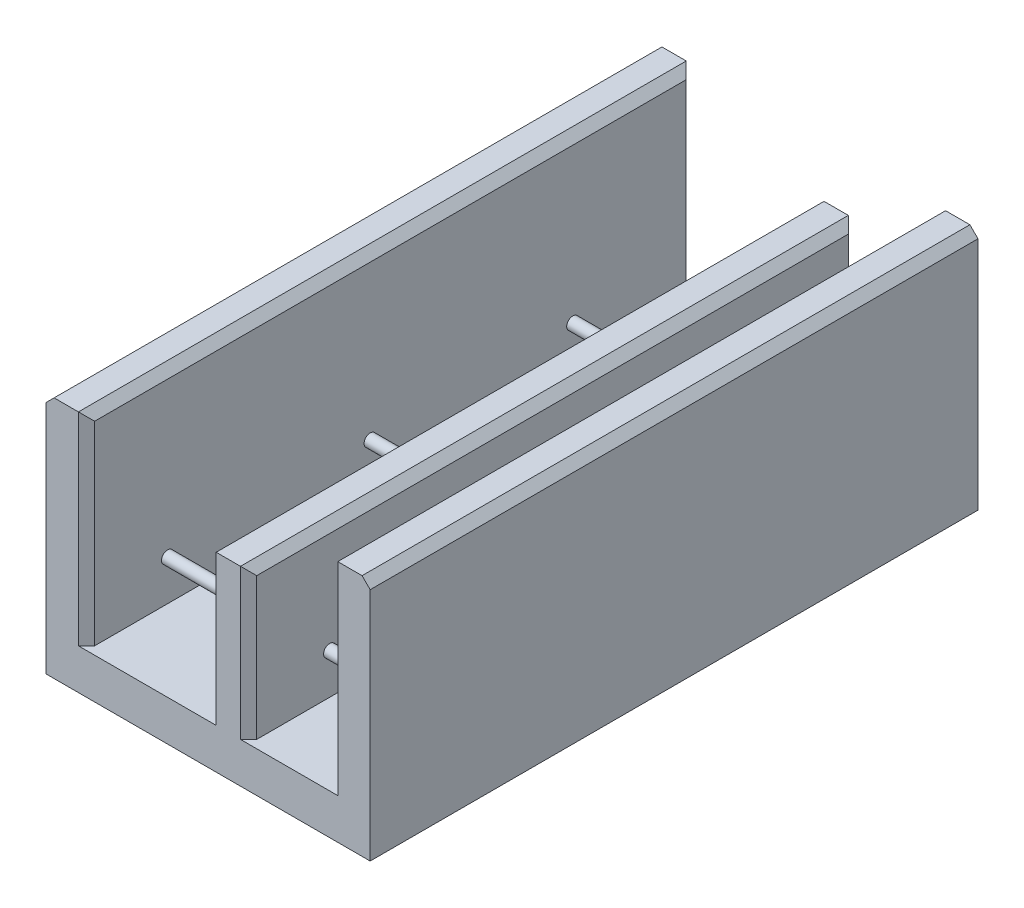
ISO-10303-21;
HEADER;
FILE_DESCRIPTION(('STEP AP214'),'2;1');
FILE_NAME('part.step','',(''),(''),'','','');
FILE_SCHEMA(('AUTOMOTIVE_DESIGN { 1 0 10303 214 1 1 1 1 }'));
ENDSEC;
DATA;
#1=APPLICATION_CONTEXT('core data for automotive mechanical design processes');
#2=APPLICATION_PROTOCOL_DEFINITION('international standard','automotive_design',2000,#1);
#3=PRODUCT_CONTEXT('',#1,'mechanical');
#4=PRODUCT('Part','Part','',(#3));
#5=PRODUCT_RELATED_PRODUCT_CATEGORY('part','',(#4));
#6=PRODUCT_DEFINITION_FORMATION('','',#4);
#7=PRODUCT_DEFINITION_CONTEXT('part definition',#1,'design');
#8=PRODUCT_DEFINITION('design','',#6,#7);
#9=PRODUCT_DEFINITION_SHAPE('','',#8);
#10=(LENGTH_UNIT() NAMED_UNIT(*) SI_UNIT(.MILLI.,.METRE.));
#11=(NAMED_UNIT(*) PLANE_ANGLE_UNIT() SI_UNIT($,.RADIAN.));
#12=(NAMED_UNIT(*) SI_UNIT($,.STERADIAN.) SOLID_ANGLE_UNIT());
#13=UNCERTAINTY_MEASURE_WITH_UNIT(LENGTH_MEASURE(1.E-05),#10,'distance_accuracy_value','');
#14=(GEOMETRIC_REPRESENTATION_CONTEXT(3) GLOBAL_UNCERTAINTY_ASSIGNED_CONTEXT((#13)) GLOBAL_UNIT_ASSIGNED_CONTEXT((#10,
#11,#12)) REPRESENTATION_CONTEXT('',''));
#15=CARTESIAN_POINT('',(0.,0.,0.));
#16=DIRECTION('',(0.,0.,1.));
#17=DIRECTION('',(1.,0.,0.));
#18=AXIS2_PLACEMENT_3D('',#15,#16,#17);
#19=CARTESIAN_POINT('',(0.,600.,1500.));
#20=DIRECTION('',(-1.,0.,0.));
#21=DIRECTION('',(0.,0.,1.));
#22=AXIS2_PLACEMENT_3D('',#19,#20,#21);
#23=PLANE('',#22);
#24=DIRECTION('',(0.,1.,0.));
#25=VECTOR('',#24,1.);
#26=CARTESIAN_POINT('',(0.,600.,0.));
#27=LINE('',#26,#25);
#28=CARTESIAN_POINT('',(0.,0.,0.));
#29=VERTEX_POINT('',#28);
#30=CARTESIAN_POINT('',(0.,580.,0.));
#31=VERTEX_POINT('',#30);
#32=EDGE_CURVE('E219',#29,#31,#27,.T.);
#33=ORIENTED_EDGE('',*,*,#32,.T.);
#34=DIRECTION('',(0.,0.,1.));
#35=VECTOR('',#34,1.);
#36=CARTESIAN_POINT('',(0.,580.,1500.));
#37=LINE('',#36,#35);
#38=CARTESIAN_POINT('',(0.,580.,1500.));
#39=VERTEX_POINT('',#38);
#40=EDGE_CURVE('E289',#31,#39,#37,.T.);
#41=ORIENTED_EDGE('',*,*,#40,.T.);
#42=DIRECTION('',(0.,1.,0.));
#43=VECTOR('',#42,1.);
#44=CARTESIAN_POINT('',(0.,600.,1500.));
#45=LINE('',#44,#43);
#46=CARTESIAN_POINT('',(0.,0.,1500.));
#47=VERTEX_POINT('',#46);
#48=EDGE_CURVE('E238',#47,#39,#45,.T.);
#49=ORIENTED_EDGE('',*,*,#48,.F.);
#50=DIRECTION('',(0.,0.,-1.));
#51=VECTOR('',#50,1.);
#52=CARTESIAN_POINT('',(0.,0.,1500.));
#53=LINE('',#52,#51);
#54=EDGE_CURVE('E210',#47,#29,#53,.T.);
#55=ORIENTED_EDGE('',*,*,#54,.T.);
#56=EDGE_LOOP('',(#33,#41,#49,#55));
#57=FACE_BOUND('',#56,.T.);
#58=ADVANCED_FACE('F37',(#57),#23,.F.);
#59=CARTESIAN_POINT('',(-100.,600.,1500.));
#60=DIRECTION('',(0.,-1.,0.));
#61=DIRECTION('',(0.,0.,-1.));
#62=AXIS2_PLACEMENT_3D('',#59,#60,#61);
#63=PLANE('',#62);
#64=DIRECTION('',(-1.,0.,0.));
#65=VECTOR('',#64,1.);
#66=CARTESIAN_POINT('',(-100.,600.,1500.));
#67=LINE('',#66,#65);
#68=CARTESIAN_POINT('',(-19.9999999999998,600.,1500.));
#69=VERTEX_POINT('',#68);
#70=CARTESIAN_POINT('',(-80.0000000000002,600.,1500.));
#71=VERTEX_POINT('',#70);
#72=EDGE_CURVE('E369',#69,#71,#67,.T.);
#73=ORIENTED_EDGE('',*,*,#72,.F.);
#74=DIRECTION('',(0.,0.,-1.));
#75=VECTOR('',#74,1.);
#76=CARTESIAN_POINT('',(-19.9999999999998,600.,1500.));
#77=LINE('',#76,#75);
#78=CARTESIAN_POINT('',(-19.9999999999998,600.,0.));
#79=VERTEX_POINT('',#78);
#80=EDGE_CURVE('E286',#69,#79,#77,.T.);
#81=ORIENTED_EDGE('',*,*,#80,.T.);
#82=DIRECTION('',(-1.,0.,0.));
#83=VECTOR('',#82,1.);
#84=CARTESIAN_POINT('',(-100.,600.,0.));
#85=LINE('',#84,#83);
#86=CARTESIAN_POINT('',(-80.0000000000002,600.,0.));
#87=VERTEX_POINT('',#86);
#88=EDGE_CURVE('E222',#79,#87,#85,.T.);
#89=ORIENTED_EDGE('',*,*,#88,.T.);
#90=DIRECTION('',(0.,0.,1.));
#91=VECTOR('',#90,1.);
#92=CARTESIAN_POINT('',(-80.0000000000002,600.,1500.));
#93=LINE('',#92,#91);
#94=EDGE_CURVE('E284',#87,#71,#93,.T.);
#95=ORIENTED_EDGE('',*,*,#94,.T.);
#96=EDGE_LOOP('',(#73,#81,#89,#95));
#97=FACE_BOUND('',#96,.T.);
#98=ADVANCED_FACE('F398',(#97),#63,.F.);
#99=CARTESIAN_POINT('',(-100.,99.9999999999998,1500.));
#100=DIRECTION('',(1.,0.,0.));
#101=DIRECTION('',(0.,0.,-1.));
#102=AXIS2_PLACEMENT_3D('',#99,#100,#101);
#103=PLANE('',#102);
#104=CARTESIAN_POINT('',(-100.,200.,1300.));
#105=DIRECTION('',(1.,0.,0.));
#106=DIRECTION('',(0.,0.,-1.));
#107=AXIS2_PLACEMENT_3D('',#104,#105,#106);
#108=CIRCLE('',#107,15.);
#109=CARTESIAN_POINT('',(-100.,200.,1285.));
#110=VERTEX_POINT('',#109);
#111=EDGE_CURVE('E813',#110,#110,#108,.F.);
#112=ORIENTED_EDGE('',*,*,#111,.F.);
#113=EDGE_LOOP('',(#112));
#114=FACE_BOUND('',#113,.T.);
#115=CARTESIAN_POINT('',(-100.,200.,800.));
#116=DIRECTION('',(1.,0.,0.));
#117=DIRECTION('',(0.,0.,-1.));
#118=AXIS2_PLACEMENT_3D('',#115,#116,#117);
#119=CIRCLE('',#118,15.);
#120=CARTESIAN_POINT('',(-100.,200.,785.));
#121=VERTEX_POINT('',#120);
#122=EDGE_CURVE('E803',#121,#121,#119,.F.);
#123=ORIENTED_EDGE('',*,*,#122,.F.);
#124=EDGE_LOOP('',(#123));
#125=FACE_BOUND('',#124,.T.);
#126=CARTESIAN_POINT('',(-100.,200.,300.));
#127=DIRECTION('',(1.,0.,0.));
#128=DIRECTION('',(0.,0.,-1.));
#129=AXIS2_PLACEMENT_3D('',#126,#127,#128);
#130=CIRCLE('',#129,15.);
#131=CARTESIAN_POINT('',(-100.,200.,285.));
#132=VERTEX_POINT('',#131);
#133=EDGE_CURVE('E544',#132,#132,#130,.F.);
#134=ORIENTED_EDGE('',*,*,#133,.F.);
#135=EDGE_LOOP('',(#134));
#136=FACE_BOUND('',#135,.T.);
#137=DIRECTION('',(0.,0.,-1.));
#138=VECTOR('',#137,1.);
#139=CARTESIAN_POINT('',(-100.,580.,1500.));
#140=LINE('',#139,#138);
#141=CARTESIAN_POINT('',(-100.,580.,1480.));
#142=VERTEX_POINT('',#141);
#143=CARTESIAN_POINT('',(-100.,580.,20.));
#144=VERTEX_POINT('',#143);
#145=EDGE_CURVE('E300',#142,#144,#140,.T.);
#146=ORIENTED_EDGE('',*,*,#145,.T.);
#147=DIRECTION('',(0.,-1.,0.));
#148=VECTOR('',#147,1.);
#149=CARTESIAN_POINT('',(-100.,99.9999999999998,20.));
#150=LINE('',#149,#148);
#151=CARTESIAN_POINT('',(-100.,99.9999999999998,20.));
#152=VERTEX_POINT('',#151);
#153=EDGE_CURVE('E302',#144,#152,#150,.T.);
#154=ORIENTED_EDGE('',*,*,#153,.T.);
#155=DIRECTION('',(0.,0.,-1.));
#156=VECTOR('',#155,1.);
#157=CARTESIAN_POINT('',(-100.,99.9999999999998,1500.));
#158=LINE('',#157,#156);
#159=CARTESIAN_POINT('',(-100.,99.9999999999998,1480.));
#160=VERTEX_POINT('',#159);
#161=EDGE_CURVE('E248',#160,#152,#158,.T.);
#162=ORIENTED_EDGE('',*,*,#161,.F.);
#163=DIRECTION('',(0.,1.,0.));
#164=VECTOR('',#163,1.);
#165=CARTESIAN_POINT('',(-100.,99.9999999999998,1480.));
#166=LINE('',#165,#164);
#167=EDGE_CURVE('E298',#160,#142,#166,.T.);
#168=ORIENTED_EDGE('',*,*,#167,.T.);
#169=EDGE_LOOP('',(#146,#154,#162,#168));
#170=FACE_BOUND('',#169,.T.);
#171=ADVANCED_FACE('F418',(#114,#125,#136,#170),#103,.F.);
#172=CARTESIAN_POINT('',(-300.,99.9999999999998,1500.));
#173=DIRECTION('',(0.,-1.,0.));
#174=DIRECTION('',(0.,0.,-1.));
#175=AXIS2_PLACEMENT_3D('',#172,#173,#174);
#176=PLANE('',#175);
#177=DIRECTION('',(-1.,0.,0.));
#178=VECTOR('',#177,1.);
#179=CARTESIAN_POINT('',(-300.,99.9999999999998,0.));
#180=LINE('',#179,#178);
#181=CARTESIAN_POINT('',(-80.0000000000002,99.9999999999998,0.));
#182=VERTEX_POINT('',#181);
#183=CARTESIAN_POINT('',(-320.000000000001,99.9999999999998,0.));
#184=VERTEX_POINT('',#183);
#185=EDGE_CURVE('E226',#182,#184,#180,.T.);
#186=ORIENTED_EDGE('',*,*,#185,.T.);
#187=DIRECTION('',(0.707106781186548,0.,0.707106781186547));
#188=VECTOR('',#187,1.);
#189=CARTESIAN_POINT('',(440.,99.9999999999998,760.));
#190=LINE('',#189,#188);
#191=CARTESIAN_POINT('',(-300.,99.9999999999998,20.0000000000005));
#192=VERTEX_POINT('',#191);
#193=EDGE_CURVE('E330',#184,#192,#190,.T.);
#194=ORIENTED_EDGE('',*,*,#193,.T.);
#195=DIRECTION('',(0.,0.,-1.));
#196=VECTOR('',#195,1.);
#197=CARTESIAN_POINT('',(-300.,99.9999999999998,1500.));
#198=LINE('',#197,#196);
#199=CARTESIAN_POINT('',(-300.,99.9999999999998,1480.));
#200=VERTEX_POINT('',#199);
#201=EDGE_CURVE('E245',#200,#192,#198,.T.);
#202=ORIENTED_EDGE('',*,*,#201,.F.);
#203=DIRECTION('',(0.707106781186548,0.,-0.707106781186547));
#204=VECTOR('',#203,1.);
#205=CARTESIAN_POINT('',(-310.,99.9999999999998,1490.));
#206=LINE('',#205,#204);
#207=CARTESIAN_POINT('',(-320.000000000001,99.9999999999998,1500.));
#208=VERTEX_POINT('',#207);
#209=EDGE_CURVE('E332',#200,#208,#206,.F.);
#210=ORIENTED_EDGE('',*,*,#209,.T.);
#211=DIRECTION('',(-1.,0.,0.));
#212=VECTOR('',#211,1.);
#213=CARTESIAN_POINT('',(-300.,99.9999999999998,1500.));
#214=LINE('',#213,#212);
#215=CARTESIAN_POINT('',(-80.0000000000002,99.9999999999998,1500.));
#216=VERTEX_POINT('',#215);
#217=EDGE_CURVE('E372',#216,#208,#214,.T.);
#218=ORIENTED_EDGE('',*,*,#217,.F.);
#219=DIRECTION('',(0.707106781186548,0.,0.707106781186548));
#220=VECTOR('',#219,1.);
#221=CARTESIAN_POINT('',(-190.,99.9999999999998,1390.));
#222=LINE('',#221,#220);
#223=EDGE_CURVE('E328',#216,#160,#222,.F.);
#224=ORIENTED_EDGE('',*,*,#223,.T.);
#225=ORIENTED_EDGE('',*,*,#161,.T.);
#226=DIRECTION('',(0.707106781186548,0.,-0.707106781186548));
#227=VECTOR('',#226,1.);
#228=CARTESIAN_POINT('',(-940.,99.9999999999998,860.));
#229=LINE('',#228,#227);
#230=EDGE_CURVE('E325',#152,#182,#229,.T.);
#231=ORIENTED_EDGE('',*,*,#230,.T.);
#232=EDGE_LOOP('',(#186,#194,#202,#210,#218,#224,#225,#231));
#233=FACE_BOUND('',#232,.T.);
#234=ADVANCED_FACE('F416',(#233),#176,.F.);
#235=CARTESIAN_POINT('',(-300.,470.,1500.));
#236=DIRECTION('',(-1.,0.,0.));
#237=DIRECTION('',(0.,-1.,0.));
#238=AXIS2_PLACEMENT_3D('',#235,#236,#237);
#239=PLANE('',#238);
#240=CARTESIAN_POINT('',(-300.,200.,1300.));
#241=DIRECTION('',(-1.,0.,0.));
#242=DIRECTION('',(0.,-1.,0.));
#243=AXIS2_PLACEMENT_3D('',#240,#241,#242);
#244=CIRCLE('',#243,15.);
#245=CARTESIAN_POINT('',(-300.,185.,1300.));
#246=VERTEX_POINT('',#245);
#247=EDGE_CURVE('E537',#246,#246,#244,.T.);
#248=ORIENTED_EDGE('',*,*,#247,.T.);
#249=EDGE_LOOP('',(#248));
#250=FACE_BOUND('',#249,.T.);
#251=CARTESIAN_POINT('',(-300.,200.,800.));
#252=DIRECTION('',(-1.,0.,0.));
#253=DIRECTION('',(0.,-1.,0.));
#254=AXIS2_PLACEMENT_3D('',#251,#252,#253);
#255=CIRCLE('',#254,15.);
#256=CARTESIAN_POINT('',(-300.,185.,800.));
#257=VERTEX_POINT('',#256);
#258=EDGE_CURVE('E540',#257,#257,#255,.T.);
#259=ORIENTED_EDGE('',*,*,#258,.T.);
#260=EDGE_LOOP('',(#259));
#261=FACE_BOUND('',#260,.T.);
#262=CARTESIAN_POINT('',(-300.,200.,300.));
#263=DIRECTION('',(-1.,0.,0.));
#264=DIRECTION('',(0.,-1.,0.));
#265=AXIS2_PLACEMENT_3D('',#262,#263,#264);
#266=CIRCLE('',#265,15.);
#267=CARTESIAN_POINT('',(-300.,185.,300.));
#268=VERTEX_POINT('',#267);
#269=EDGE_CURVE('E353',#268,#268,#266,.T.);
#270=ORIENTED_EDGE('',*,*,#269,.T.);
#271=EDGE_LOOP('',(#270));
#272=FACE_BOUND('',#271,.T.);
#273=ORIENTED_EDGE('',*,*,#201,.T.);
#274=DIRECTION('',(0.,1.,0.));
#275=VECTOR('',#274,1.);
#276=CARTESIAN_POINT('',(-300.,470.,20.0000000000005));
#277=LINE('',#276,#275);
#278=CARTESIAN_POINT('',(-300.,449.999999999999,20.0000000000005));
#279=VERTEX_POINT('',#278);
#280=EDGE_CURVE('E309',#192,#279,#277,.T.);
#281=ORIENTED_EDGE('',*,*,#280,.T.);
#282=DIRECTION('',(0.,0.,1.));
#283=VECTOR('',#282,1.);
#284=CARTESIAN_POINT('',(-300.,449.999999999999,1500.));
#285=LINE('',#284,#283);
#286=CARTESIAN_POINT('',(-300.,449.999999999999,1480.));
#287=VERTEX_POINT('',#286);
#288=EDGE_CURVE('E305',#279,#287,#285,.T.);
#289=ORIENTED_EDGE('',*,*,#288,.T.);
#290=DIRECTION('',(0.,-1.,0.));
#291=VECTOR('',#290,1.);
#292=CARTESIAN_POINT('',(-300.,470.,1480.));
#293=LINE('',#292,#291);
#294=EDGE_CURVE('E307',#287,#200,#293,.T.);
#295=ORIENTED_EDGE('',*,*,#294,.T.);
#296=EDGE_LOOP('',(#273,#281,#289,#295));
#297=FACE_BOUND('',#296,.T.);
#298=ADVANCED_FACE('F426',(#250,#261,#272,#297),#239,.F.);
#299=CARTESIAN_POINT('',(-400.,470.,1500.));
#300=DIRECTION('',(0.,-1.,0.));
#301=DIRECTION('',(1.,0.,0.));
#302=AXIS2_PLACEMENT_3D('',#299,#300,#301);
#303=PLANE('',#302);
#304=DIRECTION('',(-1.,0.,0.));
#305=VECTOR('',#304,1.);
#306=CARTESIAN_POINT('',(-400.,470.,1500.));
#307=LINE('',#306,#305);
#308=CARTESIAN_POINT('',(-320.000000000001,470.,1500.));
#309=VERTEX_POINT('',#308);
#310=CARTESIAN_POINT('',(-380.,470.,1500.));
#311=VERTEX_POINT('',#310);
#312=EDGE_CURVE('E374',#309,#311,#307,.T.);
#313=ORIENTED_EDGE('',*,*,#312,.F.);
#314=DIRECTION('',(0.,0.,-1.));
#315=VECTOR('',#314,1.);
#316=CARTESIAN_POINT('',(-320.000000000001,470.,1500.));
#317=LINE('',#316,#315);
#318=CARTESIAN_POINT('',(-320.000000000001,470.,0.));
#319=VERTEX_POINT('',#318);
#320=EDGE_CURVE('E314',#309,#319,#317,.T.);
#321=ORIENTED_EDGE('',*,*,#320,.T.);
#322=DIRECTION('',(-1.,0.,0.));
#323=VECTOR('',#322,1.);
#324=CARTESIAN_POINT('',(-400.,470.,0.));
#325=LINE('',#324,#323);
#326=CARTESIAN_POINT('',(-380.,470.,0.));
#327=VERTEX_POINT('',#326);
#328=EDGE_CURVE('E228',#319,#327,#325,.T.);
#329=ORIENTED_EDGE('',*,*,#328,.T.);
#330=DIRECTION('',(0.,0.,1.));
#331=VECTOR('',#330,1.);
#332=CARTESIAN_POINT('',(-380.,470.,1500.));
#333=LINE('',#332,#331);
#334=EDGE_CURVE('E312',#327,#311,#333,.T.);
#335=ORIENTED_EDGE('',*,*,#334,.T.);
#336=EDGE_LOOP('',(#313,#321,#329,#335));
#337=FACE_BOUND('',#336,.T.);
#338=ADVANCED_FACE('F487',(#337),#303,.F.);
#339=CARTESIAN_POINT('',(-400.,99.9999999999999,1500.));
#340=DIRECTION('',(1.,0.,0.));
#341=DIRECTION('',(0.,0.,-1.));
#342=AXIS2_PLACEMENT_3D('',#339,#340,#341);
#343=PLANE('',#342);
#344=CARTESIAN_POINT('',(-400.,200.,1300.));
#345=DIRECTION('',(1.,0.,0.));
#346=DIRECTION('',(0.,0.,-1.));
#347=AXIS2_PLACEMENT_3D('',#344,#345,#346);
#348=CIRCLE('',#347,15.);
#349=CARTESIAN_POINT('',(-400.,200.,1285.));
#350=VERTEX_POINT('',#349);
#351=EDGE_CURVE('E808',#350,#350,#348,.T.);
#352=ORIENTED_EDGE('',*,*,#351,.T.);
#353=EDGE_LOOP('',(#352));
#354=FACE_BOUND('',#353,.T.);
#355=CARTESIAN_POINT('',(-400.,200.,800.));
#356=DIRECTION('',(1.,0.,0.));
#357=DIRECTION('',(0.,0.,-1.));
#358=AXIS2_PLACEMENT_3D('',#355,#356,#357);
#359=CIRCLE('',#358,15.);
#360=CARTESIAN_POINT('',(-400.,200.,785.));
#361=VERTEX_POINT('',#360);
#362=EDGE_CURVE('E545',#361,#361,#359,.T.);
#363=ORIENTED_EDGE('',*,*,#362,.T.);
#364=EDGE_LOOP('',(#363));
#365=FACE_BOUND('',#364,.T.);
#366=CARTESIAN_POINT('',(-400.,200.,300.));
#367=DIRECTION('',(1.,0.,0.));
#368=DIRECTION('',(0.,0.,-1.));
#369=AXIS2_PLACEMENT_3D('',#366,#367,#368);
#370=CIRCLE('',#369,15.);
#371=CARTESIAN_POINT('',(-400.,200.,285.));
#372=VERTEX_POINT('',#371);
#373=EDGE_CURVE('E359',#372,#372,#370,.T.);
#374=ORIENTED_EDGE('',*,*,#373,.T.);
#375=EDGE_LOOP('',(#374));
#376=FACE_BOUND('',#375,.T.);
#377=DIRECTION('',(0.,0.,-1.));
#378=VECTOR('',#377,1.);
#379=CARTESIAN_POINT('',(-400.,450.,1500.));
#380=LINE('',#379,#378);
#381=CARTESIAN_POINT('',(-400.,450.,1480.));
#382=VERTEX_POINT('',#381);
#383=CARTESIAN_POINT('',(-400.,450.,20.0000000000002));
#384=VERTEX_POINT('',#383);
#385=EDGE_CURVE('E54',#382,#384,#380,.T.);
#386=ORIENTED_EDGE('',*,*,#385,.T.);
#387=DIRECTION('',(0.,-1.,0.));
#388=VECTOR('',#387,1.);
#389=CARTESIAN_POINT('',(-400.,99.9999999999999,20.0000000000002));
#390=LINE('',#389,#388);
#391=CARTESIAN_POINT('',(-400.,99.9999999999999,20.0000000000002));
#392=VERTEX_POINT('',#391);
#393=EDGE_CURVE('E318',#384,#392,#390,.T.);
#394=ORIENTED_EDGE('',*,*,#393,.T.);
#395=DIRECTION('',(0.,0.,-1.));
#396=VECTOR('',#395,1.);
#397=CARTESIAN_POINT('',(-400.,99.9999999999999,1500.));
#398=LINE('',#397,#396);
#399=CARTESIAN_POINT('',(-400.,99.9999999999999,1480.));
#400=VERTEX_POINT('',#399);
#401=EDGE_CURVE('E242',#400,#392,#398,.T.);
#402=ORIENTED_EDGE('',*,*,#401,.F.);
#403=DIRECTION('',(0.,1.,0.));
#404=VECTOR('',#403,1.);
#405=CARTESIAN_POINT('',(-400.,99.9999999999999,1480.));
#406=LINE('',#405,#404);
#407=EDGE_CURVE('E59',#400,#382,#406,.T.);
#408=ORIENTED_EDGE('',*,*,#407,.T.);
#409=EDGE_LOOP('',(#386,#394,#402,#408));
#410=FACE_BOUND('',#409,.T.);
#411=ADVANCED_FACE('F498',(#354,#365,#376,#410),#343,.F.);
#412=CARTESIAN_POINT('',(-700.,99.9999999999999,1500.));
#413=DIRECTION('',(0.,-1.,0.));
#414=DIRECTION('',(1.,0.,0.));
#415=AXIS2_PLACEMENT_3D('',#412,#413,#414);
#416=PLANE('',#415);
#417=DIRECTION('',(-1.,0.,0.));
#418=VECTOR('',#417,1.);
#419=CARTESIAN_POINT('',(-700.,99.9999999999999,0.));
#420=LINE('',#419,#418);
#421=CARTESIAN_POINT('',(-380.,99.9999999999999,0.));
#422=VERTEX_POINT('',#421);
#423=CARTESIAN_POINT('',(-720.,99.9999999999999,0.));
#424=VERTEX_POINT('',#423);
#425=EDGE_CURVE('E231',#422,#424,#420,.T.);
#426=ORIENTED_EDGE('',*,*,#425,.T.);
#427=DIRECTION('',(0.707106781186545,0.,0.70710678118655));
#428=VECTOR('',#427,1.);
#429=CARTESIAN_POINT('',(39.9999999999997,99.9999999999999,760.000000000005));
#430=LINE('',#429,#428);
#431=CARTESIAN_POINT('',(-700.,99.9999999999999,20.0000000000002));
#432=VERTEX_POINT('',#431);
#433=EDGE_CURVE('E320',#424,#432,#430,.T.);
#434=ORIENTED_EDGE('',*,*,#433,.T.);
#435=DIRECTION('',(0.,0.,-1.));
#436=VECTOR('',#435,1.);
#437=CARTESIAN_POINT('',(-700.,99.9999999999999,1500.));
#438=LINE('',#437,#436);
#439=CARTESIAN_POINT('',(-700.,99.9999999999999,1480.));
#440=VERTEX_POINT('',#439);
#441=EDGE_CURVE('E209',#440,#432,#438,.T.);
#442=ORIENTED_EDGE('',*,*,#441,.F.);
#443=DIRECTION('',(0.707106781186545,0.,-0.70710678118655));
#444=VECTOR('',#443,1.);
#445=CARTESIAN_POINT('',(-710.,99.9999999999999,1490.));
#446=LINE('',#445,#444);
#447=CARTESIAN_POINT('',(-720.,99.9999999999999,1500.));
#448=VERTEX_POINT('',#447);
#449=EDGE_CURVE('E322',#440,#448,#446,.F.);
#450=ORIENTED_EDGE('',*,*,#449,.T.);
#451=DIRECTION('',(-1.,0.,0.));
#452=VECTOR('',#451,1.);
#453=CARTESIAN_POINT('',(-700.,99.9999999999999,1500.));
#454=LINE('',#453,#452);
#455=CARTESIAN_POINT('',(-380.,99.9999999999999,1500.));
#456=VERTEX_POINT('',#455);
#457=EDGE_CURVE('E377',#456,#448,#454,.T.);
#458=ORIENTED_EDGE('',*,*,#457,.F.);
#459=DIRECTION('',(0.707106781186548,0.,0.707106781186548));
#460=VECTOR('',#459,1.);
#461=CARTESIAN_POINT('',(-540.,99.9999999999999,1340.));
#462=LINE('',#461,#460);
#463=EDGE_CURVE('E11',#456,#400,#462,.F.);
#464=ORIENTED_EDGE('',*,*,#463,.T.);
#465=ORIENTED_EDGE('',*,*,#401,.T.);
#466=DIRECTION('',(0.707106781186548,0.,-0.707106781186548));
#467=VECTOR('',#466,1.);
#468=CARTESIAN_POINT('',(-1290.,99.9999999999998,910.));
#469=LINE('',#468,#467);
#470=EDGE_CURVE('E46',#392,#422,#469,.T.);
#471=ORIENTED_EDGE('',*,*,#470,.T.);
#472=EDGE_LOOP('',(#426,#434,#442,#450,#458,#464,#465,#471));
#473=FACE_BOUND('',#472,.T.);
#474=ADVANCED_FACE('F499',(#473),#416,.F.);
#475=CARTESIAN_POINT('',(-700.,600.,1500.));
#476=DIRECTION('',(-1.,0.,0.));
#477=DIRECTION('',(0.,-1.,0.));
#478=AXIS2_PLACEMENT_3D('',#475,#476,#477);
#479=PLANE('',#478);
#480=CARTESIAN_POINT('',(-700.,200.,1300.));
#481=DIRECTION('',(-1.,0.,0.));
#482=DIRECTION('',(0.,-1.,0.));
#483=AXIS2_PLACEMENT_3D('',#480,#481,#482);
#484=CIRCLE('',#483,15.);
#485=CARTESIAN_POINT('',(-700.,185.,1300.));
#486=VERTEX_POINT('',#485);
#487=EDGE_CURVE('E811',#486,#486,#484,.T.);
#488=ORIENTED_EDGE('',*,*,#487,.T.);
#489=EDGE_LOOP('',(#488));
#490=FACE_BOUND('',#489,.T.);
#491=CARTESIAN_POINT('',(-700.,200.,800.));
#492=DIRECTION('',(-1.,0.,0.));
#493=DIRECTION('',(0.,-1.,0.));
#494=AXIS2_PLACEMENT_3D('',#491,#492,#493);
#495=CIRCLE('',#494,15.);
#496=CARTESIAN_POINT('',(-700.,185.,800.));
#497=VERTEX_POINT('',#496);
#498=EDGE_CURVE('E550',#497,#497,#495,.T.);
#499=ORIENTED_EDGE('',*,*,#498,.T.);
#500=EDGE_LOOP('',(#499));
#501=FACE_BOUND('',#500,.T.);
#502=CARTESIAN_POINT('',(-700.,200.,300.));
#503=DIRECTION('',(-1.,0.,0.));
#504=DIRECTION('',(0.,-1.,0.));
#505=AXIS2_PLACEMENT_3D('',#502,#503,#504);
#506=CIRCLE('',#505,15.);
#507=CARTESIAN_POINT('',(-700.,185.,300.));
#508=VERTEX_POINT('',#507);
#509=EDGE_CURVE('E364',#508,#508,#506,.T.);
#510=ORIENTED_EDGE('',*,*,#509,.T.);
#511=EDGE_LOOP('',(#510));
#512=FACE_BOUND('',#511,.T.);
#513=ORIENTED_EDGE('',*,*,#441,.T.);
#514=DIRECTION('',(0.,1.,0.));
#515=VECTOR('',#514,1.);
#516=CARTESIAN_POINT('',(-700.,600.,20.0000000000002));
#517=LINE('',#516,#515);
#518=CARTESIAN_POINT('',(-700.,580.,20.0000000000002));
#519=VERTEX_POINT('',#518);
#520=EDGE_CURVE('E295',#432,#519,#517,.T.);
#521=ORIENTED_EDGE('',*,*,#520,.T.);
#522=DIRECTION('',(0.,0.,1.));
#523=VECTOR('',#522,1.);
#524=CARTESIAN_POINT('',(-700.,580.,1500.));
#525=LINE('',#524,#523);
#526=CARTESIAN_POINT('',(-700.,580.,1480.));
#527=VERTEX_POINT('',#526);
#528=EDGE_CURVE('E293',#519,#527,#525,.T.);
#529=ORIENTED_EDGE('',*,*,#528,.T.);
#530=DIRECTION('',(0.,-1.,0.));
#531=VECTOR('',#530,1.);
#532=CARTESIAN_POINT('',(-700.,600.,1480.));
#533=LINE('',#532,#531);
#534=EDGE_CURVE('E291',#527,#440,#533,.T.);
#535=ORIENTED_EDGE('',*,*,#534,.T.);
#536=EDGE_LOOP('',(#513,#521,#529,#535));
#537=FACE_BOUND('',#536,.T.);
#538=ADVANCED_FACE('F511',(#490,#501,#512,#537),#479,.F.);
#539=CARTESIAN_POINT('',(-800.,600.,1500.));
#540=DIRECTION('',(0.,-1.,0.));
#541=DIRECTION('',(0.,0.,-1.));
#542=AXIS2_PLACEMENT_3D('',#539,#540,#541);
#543=PLANE('',#542);
#544=DIRECTION('',(-1.,0.,0.));
#545=VECTOR('',#544,1.);
#546=CARTESIAN_POINT('',(-800.,600.,0.));
#547=LINE('',#546,#545);
#548=CARTESIAN_POINT('',(-720.,600.,0.));
#549=VERTEX_POINT('',#548);
#550=CARTESIAN_POINT('',(-780.,600.,0.));
#551=VERTEX_POINT('',#550);
#552=EDGE_CURVE('E233',#549,#551,#547,.T.);
#553=ORIENTED_EDGE('',*,*,#552,.T.);
#554=DIRECTION('',(0.,0.,1.));
#555=VECTOR('',#554,1.);
#556=CARTESIAN_POINT('',(-780.,600.,1500.));
#557=LINE('',#556,#555);
#558=CARTESIAN_POINT('',(-780.,600.,1500.));
#559=VERTEX_POINT('',#558);
#560=EDGE_CURVE('E269',#551,#559,#557,.T.);
#561=ORIENTED_EDGE('',*,*,#560,.T.);
#562=DIRECTION('',(-1.,0.,0.));
#563=VECTOR('',#562,1.);
#564=CARTESIAN_POINT('',(-800.,600.,1500.));
#565=LINE('',#564,#563);
#566=CARTESIAN_POINT('',(-720.,600.,1500.));
#567=VERTEX_POINT('',#566);
#568=EDGE_CURVE('E200',#567,#559,#565,.T.);
#569=ORIENTED_EDGE('',*,*,#568,.F.);
#570=DIRECTION('',(0.,0.,-1.));
#571=VECTOR('',#570,1.);
#572=CARTESIAN_POINT('',(-720.,600.,1500.));
#573=LINE('',#572,#571);
#574=EDGE_CURVE('E267',#567,#549,#573,.T.);
#575=ORIENTED_EDGE('',*,*,#574,.T.);
#576=EDGE_LOOP('',(#553,#561,#569,#575));
#577=FACE_BOUND('',#576,.T.);
#578=ADVANCED_FACE('F506',(#577),#543,.F.);
#579=CARTESIAN_POINT('',(-800.,0.,1500.));
#580=DIRECTION('',(1.,0.,0.));
#581=DIRECTION('',(0.,0.,-1.));
#582=AXIS2_PLACEMENT_3D('',#579,#580,#581);
#583=PLANE('',#582);
#584=DIRECTION('',(0.,-1.,0.));
#585=VECTOR('',#584,1.);
#586=CARTESIAN_POINT('',(-800.,0.,1500.));
#587=LINE('',#586,#585);
#588=CARTESIAN_POINT('',(-800.,580.,1500.));
#589=VERTEX_POINT('',#588);
#590=CARTESIAN_POINT('',(-800.,0.,1500.));
#591=VERTEX_POINT('',#590);
#592=EDGE_CURVE('E187',#589,#591,#587,.T.);
#593=ORIENTED_EDGE('',*,*,#592,.F.);
#594=DIRECTION('',(0.,0.,-1.));
#595=VECTOR('',#594,1.);
#596=CARTESIAN_POINT('',(-800.,580.,1500.));
#597=LINE('',#596,#595);
#598=CARTESIAN_POINT('',(-800.,580.,0.));
#599=VERTEX_POINT('',#598);
#600=EDGE_CURVE('E251',#589,#599,#597,.T.);
#601=ORIENTED_EDGE('',*,*,#600,.T.);
#602=DIRECTION('',(0.,-1.,0.));
#603=VECTOR('',#602,1.);
#604=CARTESIAN_POINT('',(-800.,0.,0.));
#605=LINE('',#604,#603);
#606=CARTESIAN_POINT('',(-800.,0.,0.));
#607=VERTEX_POINT('',#606);
#608=EDGE_CURVE('E206',#599,#607,#605,.T.);
#609=ORIENTED_EDGE('',*,*,#608,.T.);
#610=DIRECTION('',(0.,0.,-1.));
#611=VECTOR('',#610,1.);
#612=CARTESIAN_POINT('',(-800.,0.,1500.));
#613=LINE('',#612,#611);
#614=EDGE_CURVE('E203',#591,#607,#613,.T.);
#615=ORIENTED_EDGE('',*,*,#614,.F.);
#616=EDGE_LOOP('',(#593,#601,#609,#615));
#617=FACE_BOUND('',#616,.T.);
#618=ADVANCED_FACE('F204',(#617),#583,.F.);
#619=CARTESIAN_POINT('',(0.,0.,1500.));
#620=DIRECTION('',(0.,1.,0.));
#621=DIRECTION('',(-1.,0.,0.));
#622=AXIS2_PLACEMENT_3D('',#619,#620,#621);
#623=PLANE('',#622);
#624=DIRECTION('',(1.,0.,0.));
#625=VECTOR('',#624,1.);
#626=CARTESIAN_POINT('',(0.,0.,0.));
#627=LINE('',#626,#625);
#628=EDGE_CURVE('E237',#607,#29,#627,.T.);
#629=ORIENTED_EDGE('',*,*,#628,.T.);
#630=ORIENTED_EDGE('',*,*,#54,.F.);
#631=DIRECTION('',(1.,0.,0.));
#632=VECTOR('',#631,1.);
#633=CARTESIAN_POINT('',(0.,0.,1500.));
#634=LINE('',#633,#632);
#635=EDGE_CURVE('E193',#591,#47,#634,.T.);
#636=ORIENTED_EDGE('',*,*,#635,.F.);
#637=ORIENTED_EDGE('',*,*,#614,.T.);
#638=EDGE_LOOP('',(#629,#630,#636,#637));
#639=FACE_BOUND('',#638,.T.);
#640=ADVANCED_FACE('F212',(#639),#623,.F.);
#641=CARTESIAN_POINT('',(0.,0.,1500.));
#642=DIRECTION('',(0.,0.,-1.));
#643=DIRECTION('',(-1.,0.,0.));
#644=AXIS2_PLACEMENT_3D('',#641,#642,#643);
#645=PLANE('',#644);
#646=ORIENTED_EDGE('',*,*,#568,.T.);
#647=DIRECTION('',(0.707106781186551,0.707106781186544,0.));
#648=VECTOR('',#647,1.);
#649=CARTESIAN_POINT('',(-800.,580.,1500.));
#650=LINE('',#649,#648);
#651=EDGE_CURVE('E196',#559,#589,#650,.F.);
#652=ORIENTED_EDGE('',*,*,#651,.T.);
#653=ORIENTED_EDGE('',*,*,#592,.T.);
#654=ORIENTED_EDGE('',*,*,#635,.T.);
#655=ORIENTED_EDGE('',*,*,#48,.T.);
#656=DIRECTION('',(0.707106781186548,-0.707106781186548,0.));
#657=VECTOR('',#656,1.);
#658=CARTESIAN_POINT('',(-19.9999999999998,600.,1500.));
#659=LINE('',#658,#657);
#660=EDGE_CURVE('E281',#39,#69,#659,.F.);
#661=ORIENTED_EDGE('',*,*,#660,.T.);
#662=ORIENTED_EDGE('',*,*,#72,.T.);
#663=DIRECTION('',(0.,-1.,0.));
#664=VECTOR('',#663,1.);
#665=CARTESIAN_POINT('',(-80.0000000000002,0.,1500.));
#666=LINE('',#665,#664);
#667=EDGE_CURVE('E276',#71,#216,#666,.T.);
#668=ORIENTED_EDGE('',*,*,#667,.T.);
#669=ORIENTED_EDGE('',*,*,#217,.T.);
#670=DIRECTION('',(0.,1.,0.));
#671=VECTOR('',#670,1.);
#672=CARTESIAN_POINT('',(-320.000000000001,0.,1500.));
#673=LINE('',#672,#671);
#674=EDGE_CURVE('E274',#208,#309,#673,.T.);
#675=ORIENTED_EDGE('',*,*,#674,.T.);
#676=ORIENTED_EDGE('',*,*,#312,.T.);
#677=DIRECTION('',(0.,-1.,0.));
#678=VECTOR('',#677,1.);
#679=CARTESIAN_POINT('',(-380.,0.,1500.));
#680=LINE('',#679,#678);
#681=EDGE_CURVE('E271',#311,#456,#680,.T.);
#682=ORIENTED_EDGE('',*,*,#681,.T.);
#683=ORIENTED_EDGE('',*,*,#457,.T.);
#684=DIRECTION('',(0.,1.,0.));
#685=VECTOR('',#684,1.);
#686=CARTESIAN_POINT('',(-720.,1.59872115546023E-13,1500.));
#687=LINE('',#686,#685);
#688=EDGE_CURVE('E279',#448,#567,#687,.T.);
#689=ORIENTED_EDGE('',*,*,#688,.T.);
#690=EDGE_LOOP('',(#646,#652,#653,#654,#655,#661,#662,#668,#669,#675,#676,#682,#683,#689));
#691=FACE_BOUND('',#690,.T.);
#692=ADVANCED_FACE('F190',(#691),#645,.F.);
#693=CARTESIAN_POINT('',(0.,0.,0.));
#694=DIRECTION('',(0.,0.,-1.));
#695=DIRECTION('',(-1.,0.,0.));
#696=AXIS2_PLACEMENT_3D('',#693,#694,#695);
#697=PLANE('',#696);
#698=ORIENTED_EDGE('',*,*,#608,.F.);
#699=DIRECTION('',(-0.707106781186551,-0.707106781186544,0.));
#700=VECTOR('',#699,1.);
#701=CARTESIAN_POINT('',(-689.999999999996,690.000000000003,0.));
#702=LINE('',#701,#700);
#703=EDGE_CURVE('E265',#599,#551,#702,.F.);
#704=ORIENTED_EDGE('',*,*,#703,.T.);
#705=ORIENTED_EDGE('',*,*,#552,.F.);
#706=DIRECTION('',(0.,-1.,0.));
#707=VECTOR('',#706,1.);
#708=CARTESIAN_POINT('',(-720.,99.9999999999999,0.));
#709=LINE('',#708,#707);
#710=EDGE_CURVE('E260',#549,#424,#709,.T.);
#711=ORIENTED_EDGE('',*,*,#710,.T.);
#712=ORIENTED_EDGE('',*,*,#425,.F.);
#713=DIRECTION('',(0.,1.,0.));
#714=VECTOR('',#713,1.);
#715=CARTESIAN_POINT('',(-380.,470.,0.));
#716=LINE('',#715,#714);
#717=EDGE_CURVE('E253',#422,#327,#716,.T.);
#718=ORIENTED_EDGE('',*,*,#717,.T.);
#719=ORIENTED_EDGE('',*,*,#328,.F.);
#720=DIRECTION('',(0.,-1.,0.));
#721=VECTOR('',#720,1.);
#722=CARTESIAN_POINT('',(-320.000000000001,99.9999999999998,0.));
#723=LINE('',#722,#721);
#724=EDGE_CURVE('E255',#319,#184,#723,.T.);
#725=ORIENTED_EDGE('',*,*,#724,.T.);
#726=ORIENTED_EDGE('',*,*,#185,.F.);
#727=DIRECTION('',(0.,1.,0.));
#728=VECTOR('',#727,1.);
#729=CARTESIAN_POINT('',(-80.0000000000002,600.,0.));
#730=LINE('',#729,#728);
#731=EDGE_CURVE('E258',#182,#87,#730,.T.);
#732=ORIENTED_EDGE('',*,*,#731,.T.);
#733=ORIENTED_EDGE('',*,*,#88,.F.);
#734=DIRECTION('',(-0.707106781186548,0.707106781186548,0.));
#735=VECTOR('',#734,1.);
#736=CARTESIAN_POINT('',(290.,290.,0.));
#737=LINE('',#736,#735);
#738=EDGE_CURVE('E263',#79,#31,#737,.F.);
#739=ORIENTED_EDGE('',*,*,#738,.T.);
#740=ORIENTED_EDGE('',*,*,#32,.F.);
#741=ORIENTED_EDGE('',*,*,#628,.F.);
#742=EDGE_LOOP('',(#698,#704,#705,#711,#712,#718,#719,#725,#726,#732,#733,#739,#740,#741));
#743=FACE_BOUND('',#742,.T.);
#744=ADVANCED_FACE('F386',(#743),#697,.T.);
#745=CARTESIAN_POINT('',(-800.,580.,1500.));
#746=DIRECTION('',(0.707106781186544,-0.707106781186551,0.));
#747=DIRECTION('',(0.,0.,-1.));
#748=AXIS2_PLACEMENT_3D('',#745,#746,#747);
#749=PLANE('',#748);
#750=ORIENTED_EDGE('',*,*,#651,.F.);
#751=ORIENTED_EDGE('',*,*,#560,.F.);
#752=ORIENTED_EDGE('',*,*,#703,.F.);
#753=ORIENTED_EDGE('',*,*,#600,.F.);
#754=EDGE_LOOP('',(#750,#751,#752,#753));
#755=FACE_BOUND('',#754,.T.);
#756=ADVANCED_FACE('F384',(#755),#749,.F.);
#757=CARTESIAN_POINT('',(-19.9999999999998,600.,1500.));
#758=DIRECTION('',(-0.707106781186547,-0.707106781186547,0.));
#759=DIRECTION('',(0.,0.,-1.));
#760=AXIS2_PLACEMENT_3D('',#757,#758,#759);
#761=PLANE('',#760);
#762=ORIENTED_EDGE('',*,*,#660,.F.);
#763=ORIENTED_EDGE('',*,*,#40,.F.);
#764=ORIENTED_EDGE('',*,*,#738,.F.);
#765=ORIENTED_EDGE('',*,*,#80,.F.);
#766=EDGE_LOOP('',(#762,#763,#764,#765));
#767=FACE_BOUND('',#766,.T.);
#768=ADVANCED_FACE('F395',(#767),#761,.F.);
#769=CARTESIAN_POINT('',(-720.,1.59872115546023E-13,1500.));
#770=DIRECTION('',(-0.70710678118655,0.,-0.707106781186545));
#771=DIRECTION('',(0.,1.,0.));
#772=AXIS2_PLACEMENT_3D('',#769,#770,#771);
#773=PLANE('',#772);
#774=ORIENTED_EDGE('',*,*,#449,.F.);
#775=ORIENTED_EDGE('',*,*,#534,.F.);
#776=DIRECTION('',(-0.577350269189622,0.577350269189629,0.577350269189626));
#777=VECTOR('',#776,1.);
#778=CARTESIAN_POINT('',(-520.,399.999999999998,1300.));
#779=LINE('',#778,#777);
#780=EDGE_CURVE('E223',#567,#527,#779,.F.);
#781=ORIENTED_EDGE('',*,*,#780,.F.);
#782=ORIENTED_EDGE('',*,*,#688,.F.);
#783=EDGE_LOOP('',(#774,#775,#781,#782));
#784=FACE_BOUND('',#783,.T.);
#785=ADVANCED_FACE('F440',(#784),#773,.F.);
#786=CARTESIAN_POINT('',(-720.,600.,1500.));
#787=DIRECTION('',(-0.707106781186551,-0.707106781186543,0.));
#788=DIRECTION('',(0.,0.,-1.));
#789=AXIS2_PLACEMENT_3D('',#786,#787,#788);
#790=PLANE('',#789);
#791=ORIENTED_EDGE('',*,*,#780,.T.);
#792=ORIENTED_EDGE('',*,*,#528,.F.);
#793=DIRECTION('',(0.577350269189622,-0.577350269189629,0.577350269189626));
#794=VECTOR('',#793,1.);
#795=CARTESIAN_POINT('',(-220.000000000003,99.9999999999969,500.000000000001));
#796=LINE('',#795,#794);
#797=EDGE_CURVE('E337',#549,#519,#796,.T.);
#798=ORIENTED_EDGE('',*,*,#797,.F.);
#799=ORIENTED_EDGE('',*,*,#574,.F.);
#800=EDGE_LOOP('',(#791,#792,#798,#799));
#801=FACE_BOUND('',#800,.T.);
#802=ADVANCED_FACE('F444',(#801),#790,.F.);
#803=CARTESIAN_POINT('',(-700.,600.,20.0000000000002));
#804=DIRECTION('',(0.70710678118655,0.,-0.707106781186545));
#805=DIRECTION('',(0.,-1.,0.));
#806=AXIS2_PLACEMENT_3D('',#803,#804,#805);
#807=PLANE('',#806);
#808=ORIENTED_EDGE('',*,*,#433,.F.);
#809=ORIENTED_EDGE('',*,*,#710,.F.);
#810=ORIENTED_EDGE('',*,*,#797,.T.);
#811=ORIENTED_EDGE('',*,*,#520,.F.);
#812=EDGE_LOOP('',(#808,#809,#810,#811));
#813=FACE_BOUND('',#812,.T.);
#814=ADVANCED_FACE('F441',(#813),#807,.T.);
#815=CARTESIAN_POINT('',(-80.0000000000002,0.,1500.));
#816=DIRECTION('',(0.707106781186547,0.,-0.707106781186547));
#817=DIRECTION('',(0.,-1.,0.));
#818=AXIS2_PLACEMENT_3D('',#815,#816,#817);
#819=PLANE('',#818);
#820=ORIENTED_EDGE('',*,*,#223,.F.);
#821=ORIENTED_EDGE('',*,*,#667,.F.);
#822=DIRECTION('',(-0.577350269189626,-0.577350269189626,-0.577350269189626));
#823=VECTOR('',#822,1.);
#824=CARTESIAN_POINT('',(-280.,400.,1300.));
#825=LINE('',#824,#823);
#826=EDGE_CURVE('E339',#142,#71,#825,.F.);
#827=ORIENTED_EDGE('',*,*,#826,.F.);
#828=ORIENTED_EDGE('',*,*,#167,.F.);
#829=EDGE_LOOP('',(#820,#821,#827,#828));
#830=FACE_BOUND('',#829,.T.);
#831=ADVANCED_FACE('F412',(#830),#819,.F.);
#832=CARTESIAN_POINT('',(-100.,580.,1500.));
#833=DIRECTION('',(0.707106781186547,-0.707106781186547,0.));
#834=DIRECTION('',(0.,0.,-1.));
#835=AXIS2_PLACEMENT_3D('',#832,#833,#834);
#836=PLANE('',#835);
#837=ORIENTED_EDGE('',*,*,#826,.T.);
#838=ORIENTED_EDGE('',*,*,#94,.F.);
#839=DIRECTION('',(0.577350269189626,0.577350269189626,-0.577350269189626));
#840=VECTOR('',#839,1.);
#841=CARTESIAN_POINT('',(-593.333333333334,86.6666666666664,513.333333333333));
#842=LINE('',#841,#840);
#843=EDGE_CURVE('E342',#144,#87,#842,.T.);
#844=ORIENTED_EDGE('',*,*,#843,.F.);
#845=ORIENTED_EDGE('',*,*,#145,.F.);
#846=EDGE_LOOP('',(#837,#838,#844,#845));
#847=FACE_BOUND('',#846,.T.);
#848=ADVANCED_FACE('F407',(#847),#836,.F.);
#849=CARTESIAN_POINT('',(-100.,99.9999999999998,20.));
#850=DIRECTION('',(-0.707106781186547,0.,-0.707106781186547));
#851=DIRECTION('',(0.,1.,0.));
#852=AXIS2_PLACEMENT_3D('',#849,#850,#851);
#853=PLANE('',#852);
#854=ORIENTED_EDGE('',*,*,#843,.T.);
#855=ORIENTED_EDGE('',*,*,#731,.F.);
#856=ORIENTED_EDGE('',*,*,#230,.F.);
#857=ORIENTED_EDGE('',*,*,#153,.F.);
#858=EDGE_LOOP('',(#854,#855,#856,#857));
#859=FACE_BOUND('',#858,.T.);
#860=ADVANCED_FACE('F402',(#859),#853,.T.);
#861=CARTESIAN_POINT('',(-320.000000000001,0.,1500.));
#862=DIRECTION('',(-0.707106781186547,0.,-0.707106781186548));
#863=DIRECTION('',(0.,1.,0.));
#864=AXIS2_PLACEMENT_3D('',#861,#862,#863);
#865=PLANE('',#864);
#866=ORIENTED_EDGE('',*,*,#209,.F.);
#867=ORIENTED_EDGE('',*,*,#294,.F.);
#868=DIRECTION('',(0.577350269189626,-0.577350269189626,-0.577350269189625));
#869=VECTOR('',#868,1.);
#870=CARTESIAN_POINT('',(-320.000000000001,470.,1500.));
#871=LINE('',#870,#869);
#872=EDGE_CURVE('E345',#309,#287,#871,.T.);
#873=ORIENTED_EDGE('',*,*,#872,.F.);
#874=ORIENTED_EDGE('',*,*,#674,.F.);
#875=EDGE_LOOP('',(#866,#867,#873,#874));
#876=FACE_BOUND('',#875,.T.);
#877=ADVANCED_FACE('F454',(#876),#865,.F.);
#878=CARTESIAN_POINT('',(-320.000000000001,470.,1500.));
#879=DIRECTION('',(-0.707106781186548,-0.707106781186548,0.));
#880=DIRECTION('',(0.,0.,-1.));
#881=AXIS2_PLACEMENT_3D('',#878,#879,#880);
#882=PLANE('',#881);
#883=ORIENTED_EDGE('',*,*,#872,.T.);
#884=ORIENTED_EDGE('',*,*,#288,.F.);
#885=DIRECTION('',(0.577350269189626,-0.577350269189626,0.577350269189625));
#886=VECTOR('',#885,1.);
#887=CARTESIAN_POINT('',(179.999999999999,-30.0000000000001,499.999999999999));
#888=LINE('',#887,#886);
#889=EDGE_CURVE('E348',#319,#279,#888,.T.);
#890=ORIENTED_EDGE('',*,*,#889,.F.);
#891=ORIENTED_EDGE('',*,*,#320,.F.);
#892=EDGE_LOOP('',(#883,#884,#890,#891));
#893=FACE_BOUND('',#892,.T.);
#894=ADVANCED_FACE('F462',(#893),#882,.F.);
#895=CARTESIAN_POINT('',(-300.,470.,20.0000000000005));
#896=DIRECTION('',(0.707106781186547,0.,-0.707106781186548));
#897=DIRECTION('',(0.,-1.,0.));
#898=AXIS2_PLACEMENT_3D('',#895,#896,#897);
#899=PLANE('',#898);
#900=ORIENTED_EDGE('',*,*,#193,.F.);
#901=ORIENTED_EDGE('',*,*,#724,.F.);
#902=ORIENTED_EDGE('',*,*,#889,.T.);
#903=ORIENTED_EDGE('',*,*,#280,.F.);
#904=EDGE_LOOP('',(#900,#901,#902,#903));
#905=FACE_BOUND('',#904,.T.);
#906=ADVANCED_FACE('F459',(#905),#899,.T.);
#907=CARTESIAN_POINT('',(-380.,0.,1500.));
#908=DIRECTION('',(0.707106781186547,0.,-0.707106781186547));
#909=DIRECTION('',(0.,-1.,0.));
#910=AXIS2_PLACEMENT_3D('',#907,#908,#909);
#911=PLANE('',#910);
#912=ORIENTED_EDGE('',*,*,#463,.F.);
#913=ORIENTED_EDGE('',*,*,#681,.F.);
#914=DIRECTION('',(0.577350269189626,0.577350269189626,0.577350269189626));
#915=VECTOR('',#914,1.);
#916=CARTESIAN_POINT('',(-393.333333333333,456.666666666666,1486.66666666667));
#917=LINE('',#916,#915);
#918=EDGE_CURVE('E41',#382,#311,#917,.T.);
#919=ORIENTED_EDGE('',*,*,#918,.F.);
#920=ORIENTED_EDGE('',*,*,#407,.F.);
#921=EDGE_LOOP('',(#912,#913,#919,#920));
#922=FACE_BOUND('',#921,.T.);
#923=ADVANCED_FACE('F39',(#922),#911,.F.);
#924=CARTESIAN_POINT('',(-400.,450.,1500.));
#925=DIRECTION('',(0.707106781186547,-0.707106781186547,0.));
#926=DIRECTION('',(0.,0.,-1.));
#927=AXIS2_PLACEMENT_3D('',#924,#925,#926);
#928=PLANE('',#927);
#929=ORIENTED_EDGE('',*,*,#918,.T.);
#930=ORIENTED_EDGE('',*,*,#334,.F.);
#931=DIRECTION('',(0.577350269189626,0.577350269189626,-0.577350269189626));
#932=VECTOR('',#931,1.);
#933=CARTESIAN_POINT('',(-893.333333333334,-43.3333333333338,513.333333333333));
#934=LINE('',#933,#932);
#935=EDGE_CURVE('E351',#384,#327,#934,.T.);
#936=ORIENTED_EDGE('',*,*,#935,.F.);
#937=ORIENTED_EDGE('',*,*,#385,.F.);
#938=EDGE_LOOP('',(#929,#930,#936,#937));
#939=FACE_BOUND('',#938,.T.);
#940=ADVANCED_FACE('F473',(#939),#928,.F.);
#941=CARTESIAN_POINT('',(-400.,99.9999999999999,20.0000000000002));
#942=DIRECTION('',(-0.707106781186547,0.,-0.707106781186547));
#943=DIRECTION('',(0.,1.,0.));
#944=AXIS2_PLACEMENT_3D('',#941,#942,#943);
#945=PLANE('',#944);
#946=ORIENTED_EDGE('',*,*,#935,.T.);
#947=ORIENTED_EDGE('',*,*,#717,.F.);
#948=ORIENTED_EDGE('',*,*,#470,.F.);
#949=ORIENTED_EDGE('',*,*,#393,.F.);
#950=EDGE_LOOP('',(#946,#947,#948,#949));
#951=FACE_BOUND('',#950,.T.);
#952=ADVANCED_FACE('F470',(#951),#945,.T.);
#953=CARTESIAN_POINT('',(-57.5735931288072,200.,300.));
#954=DIRECTION('',(-1.,0.,0.));
#955=DIRECTION('',(0.,0.,1.));
#956=AXIS2_PLACEMENT_3D('',#953,#954,#955);
#957=CYLINDRICAL_SURFACE('',#956,15.);
#958=ORIENTED_EDGE('',*,*,#509,.F.);
#959=EDGE_LOOP('',(#958));
#960=FACE_BOUND('',#959,.T.);
#961=ORIENTED_EDGE('',*,*,#373,.F.);
#962=EDGE_LOOP('',(#961));
#963=FACE_BOUND('',#962,.T.);
#964=ADVANCED_FACE('F472',(#960,#963),#957,.T.);
#965=ORIENTED_EDGE('',*,*,#133,.T.);
#966=EDGE_LOOP('',(#965));
#967=FACE_BOUND('',#966,.T.);
#968=ORIENTED_EDGE('',*,*,#269,.F.);
#969=EDGE_LOOP('',(#968));
#970=FACE_BOUND('',#969,.T.);
#971=ADVANCED_FACE('F559',(#967,#970),#957,.T.);
#972=CARTESIAN_POINT('',(-57.5735931288072,200.,800.));
#973=DIRECTION('',(-1.,0.,0.));
#974=DIRECTION('',(0.,0.,1.));
#975=AXIS2_PLACEMENT_3D('',#972,#973,#974);
#976=CYLINDRICAL_SURFACE('',#975,15.);
#977=ORIENTED_EDGE('',*,*,#498,.F.);
#978=EDGE_LOOP('',(#977));
#979=FACE_BOUND('',#978,.T.);
#980=ORIENTED_EDGE('',*,*,#362,.F.);
#981=EDGE_LOOP('',(#980));
#982=FACE_BOUND('',#981,.T.);
#983=ADVANCED_FACE('F566',(#979,#982),#976,.T.);
#984=ORIENTED_EDGE('',*,*,#122,.T.);
#985=EDGE_LOOP('',(#984));
#986=FACE_BOUND('',#985,.T.);
#987=ORIENTED_EDGE('',*,*,#258,.F.);
#988=EDGE_LOOP('',(#987));
#989=FACE_BOUND('',#988,.T.);
#990=ADVANCED_FACE('F570',(#986,#989),#976,.T.);
#991=CARTESIAN_POINT('',(-57.5735931288072,200.,1300.));
#992=DIRECTION('',(-1.,0.,0.));
#993=DIRECTION('',(0.,0.,1.));
#994=AXIS2_PLACEMENT_3D('',#991,#992,#993);
#995=CYLINDRICAL_SURFACE('',#994,15.);
#996=ORIENTED_EDGE('',*,*,#487,.F.);
#997=EDGE_LOOP('',(#996));
#998=FACE_BOUND('',#997,.T.);
#999=ORIENTED_EDGE('',*,*,#351,.F.);
#1000=EDGE_LOOP('',(#999));
#1001=FACE_BOUND('',#1000,.T.);
#1002=ADVANCED_FACE('F765',(#998,#1001),#995,.T.);
#1003=ORIENTED_EDGE('',*,*,#111,.T.);
#1004=EDGE_LOOP('',(#1003));
#1005=FACE_BOUND('',#1004,.T.);
#1006=ORIENTED_EDGE('',*,*,#247,.F.);
#1007=EDGE_LOOP('',(#1006));
#1008=FACE_BOUND('',#1007,.T.);
#1009=ADVANCED_FACE('F760',(#1005,#1008),#995,.T.);
#1010=CLOSED_SHELL('',(#58,#98,#171,#234,#298,#338,#411,#474,#538,#578,#618,#640,#692,#744,#756,
#768,#785,#802,#814,#831,#848,#860,#877,#894,#906,#923,#940,#952,#964,#971,#983,#990,#1002,#1009));
#1011=MANIFOLD_SOLID_BREP('B2',#1010);
#1012=ADVANCED_BREP_SHAPE_REPRESENTATION('',(#18,#1011),#14);
#1013=SHAPE_DEFINITION_REPRESENTATION(#9,#1012);
ENDSEC;
END-ISO-10303-21;
